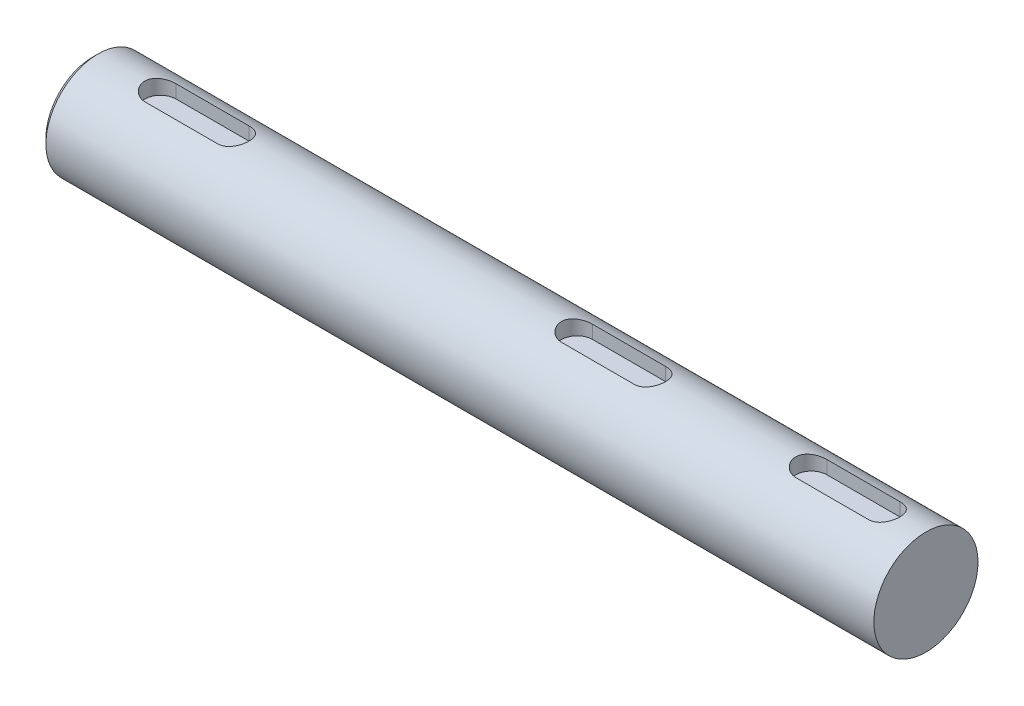
ISO-10303-21;
HEADER;
FILE_DESCRIPTION(('STEP AP214'),'2;1');
FILE_NAME('part.step','',(''),(''),'','','');
FILE_SCHEMA(('AUTOMOTIVE_DESIGN { 1 0 10303 214 1 1 1 1 }'));
ENDSEC;
DATA;
#1=APPLICATION_CONTEXT('core data for automotive mechanical design processes');
#2=APPLICATION_PROTOCOL_DEFINITION('international standard','automotive_design',2000,#1);
#3=PRODUCT_CONTEXT('',#1,'mechanical');
#4=PRODUCT('Part','Part','',(#3));
#5=PRODUCT_RELATED_PRODUCT_CATEGORY('part','',(#4));
#6=PRODUCT_DEFINITION_FORMATION('','',#4);
#7=PRODUCT_DEFINITION_CONTEXT('part definition',#1,'design');
#8=PRODUCT_DEFINITION('design','',#6,#7);
#9=PRODUCT_DEFINITION_SHAPE('','',#8);
#10=(LENGTH_UNIT() NAMED_UNIT(*) SI_UNIT(.MILLI.,.METRE.));
#11=(NAMED_UNIT(*) PLANE_ANGLE_UNIT() SI_UNIT($,.RADIAN.));
#12=(NAMED_UNIT(*) SI_UNIT($,.STERADIAN.) SOLID_ANGLE_UNIT());
#13=UNCERTAINTY_MEASURE_WITH_UNIT(LENGTH_MEASURE(1.E-05),#10,'distance_accuracy_value','');
#14=(GEOMETRIC_REPRESENTATION_CONTEXT(3) GLOBAL_UNCERTAINTY_ASSIGNED_CONTEXT((#13)) GLOBAL_UNIT_ASSIGNED_CONTEXT((#10,
#11,#12)) REPRESENTATION_CONTEXT('',''));
#15=CARTESIAN_POINT('',(0.,0.,0.));
#16=DIRECTION('',(0.,0.,1.));
#17=DIRECTION('',(1.,0.,0.));
#18=AXIS2_PLACEMENT_3D('',#15,#16,#17);
#19=CARTESIAN_POINT('',(200.,0.,0.));
#20=DIRECTION('',(-1.,0.,0.));
#21=DIRECTION('',(0.,0.,1.));
#22=AXIS2_PLACEMENT_3D('',#19,#20,#21);
#23=CYLINDRICAL_SURFACE('',#22,10.);
#24=DIRECTION('',(-1.,0.,0.));
#25=VECTOR('',#24,1.);
#26=CARTESIAN_POINT('',(200.,9.53939201416946,-3.));
#27=LINE('',#26,#25);
#28=CARTESIAN_POINT('',(138.,9.53939201416946,-3.));
#29=VERTEX_POINT('',#28);
#30=CARTESIAN_POINT('',(152.,9.53939201416946,-3.));
#31=VERTEX_POINT('',#30);
#32=EDGE_CURVE('E11',#29,#31,#27,.F.);
#33=ORIENTED_EDGE('',*,*,#32,.T.);
#34=CARTESIAN_POINT('',(152.,9.53939201416946,-3.));
#35=CARTESIAN_POINT('',(152.082335520823,9.53938054248207,-3.00001027845728));
#36=CARTESIAN_POINT('',(152.164664455063,9.54045772064378,-2.99661062684472));
#37=CARTESIAN_POINT('',(152.328693952765,9.54470412105986,-2.98307142899347));
#38=CARTESIAN_POINT('',(152.410394653324,9.54787287296849,-2.97293339805418));
#39=CARTESIAN_POINT('',(152.572384915673,9.55620668351003,-2.94603140625045));
#40=CARTESIAN_POINT('',(152.652677524043,9.56136667250114,-2.92928426957737));
#41=CARTESIAN_POINT('',(152.811475844134,9.57351626651178,-2.88932853030395));
#42=CARTESIAN_POINT('',(152.889981509067,9.58050591937828,-2.86611975872641));
#43=CARTESIAN_POINT('',(153.12194938799,9.60391637654137,-2.78708584446025));
#44=CARTESIAN_POINT('',(153.272068438833,9.6227900783039,-2.72181852542973));
#45=CARTESIAN_POINT('',(153.559226043979,9.66493213967819,-2.56815043531277));
#46=CARTESIAN_POINT('',(153.696258470762,9.6882025429064,-2.47973889924161));
#47=CARTESIAN_POINT('',(153.957722987948,9.73733650515374,-2.27929879634443));
#48=CARTESIAN_POINT('',(154.081684874061,9.76325505469874,-2.16666914746584));
#49=CARTESIAN_POINT('',(154.309273614839,9.81429628475077,-1.92227736150434));
#50=CARTESIAN_POINT('',(154.412897033861,9.8394188301941,-1.79051199848164));
#51=CARTESIAN_POINT('',(154.598926865095,9.88666477976534,-1.50821997465698));
#52=CARTESIAN_POINT('',(154.680850179783,9.90871541546877,-1.35736167401016));
#53=CARTESIAN_POINT('',(154.817977004003,9.94668940088144,-1.04324233568303));
#54=CARTESIAN_POINT('',(154.873187403368,9.96261433032403,-0.879984508687989));
#55=CARTESIAN_POINT('',(154.953759551791,9.98615279768398,-0.550649404820608));
#56=CARTESIAN_POINT('',(154.979929703518,9.99399098526792,-0.384786253016209));
#57=CARTESIAN_POINT('',(155.004234695146,10.0012640407204,-0.0508471415689363));
#58=CARTESIAN_POINT('',(155.002374842678,10.0007004995012,0.117228393125328));
#59=CARTESIAN_POINT('',(154.971214179309,9.99139205125586,0.445143199271811));
#60=CARTESIAN_POINT('',(154.942789309192,9.98290831016512,0.605074290763014));
#61=CARTESIAN_POINT('',(154.860736730375,9.95903027401823,0.9177801043703));
#62=CARTESIAN_POINT('',(154.807107701317,9.94363561692558,1.07055445110878));
#63=CARTESIAN_POINT('',(154.675575556475,9.90730429851782,1.3666956317391));
#64=CARTESIAN_POINT('',(154.597396711224,9.88630511384915,1.50993201207611));
#65=CARTESIAN_POINT('',(154.419202819966,9.84099249303647,1.78153105916099));
#66=CARTESIAN_POINT('',(154.319182881059,9.81667831471806,1.90989038323249));
#67=CARTESIAN_POINT('',(154.095616023815,9.7662334714278,2.15330901082204));
#68=CARTESIAN_POINT('',(153.971312272474,9.74006890899097,2.26766702955975));
#69=CARTESIAN_POINT('',(153.705005153149,9.68968430229327,2.47413538985067));
#70=CARTESIAN_POINT('',(153.56299663927,9.66546482675134,2.5662392402618));
#71=CARTESIAN_POINT('',(153.2634381431,9.62154457591303,2.72632814481701));
#72=CARTESIAN_POINT('',(153.105745640813,9.60189192491895,2.79406012682262));
#73=CARTESIAN_POINT('',(152.780550992037,9.56991327306402,2.90171772009404));
#74=CARTESIAN_POINT('',(152.613064278571,9.55757606951749,2.94168586436072));
#75=CARTESIAN_POINT('',(152.37001022186,9.54628064650012,2.97802407180158));
#76=CARTESIAN_POINT('',(152.296218531641,9.54370312550533,2.98626405978017));
#77=CARTESIAN_POINT('',(152.148297041801,9.54025857223564,2.99724711229708));
#78=CARTESIAN_POINT('',(152.074167900672,9.53938902493288,2.99999825936538));
#79=CARTESIAN_POINT('',(152.,9.53939201416946,3.));
#80=B_SPLINE_CURVE_WITH_KNOTS('',3,(#34,#35,#36,#37,#38,#39,#40,#41,#42,#43,#44,#45,#46,#47,#48,
#49,#50,#51,#52,#53,#54,#55,#56,#57,#58,#59,#60,#61,#62,#63,#64,#65,#66,#67,#68,#69,#70,#71,#72,
#73,#74,#75,#76,#77,#78,#79),.UNSPECIFIED.,.F.,.F.,(4,2,2,2,2,2,2,2,2,2,2,2,2,2,2,2,2,2,2,2,2,2,
4),(0.,0.246918142439474,0.49378077770608,0.740019009623012,0.986263681482012,1.47813347402023,
1.97023245590778,2.47635119822767,2.98255536239032,3.4992281062007,4.01576751791672,
4.51753600864763,5.019209488041,5.50490358251091,5.9906231236083,6.48200583350619,
6.97349873739168,7.48389234847122,7.99443465298716,8.51013494368213,9.02504345105573,
9.24774267716775,9.47011372732391),.UNSPECIFIED.);
#81=CARTESIAN_POINT('',(152.,9.53939201416946,3.));
#82=VERTEX_POINT('',#81);
#83=EDGE_CURVE('E369',#31,#82,#80,.T.);
#84=ORIENTED_EDGE('',*,*,#83,.T.);
#85=DIRECTION('',(-1.,0.,0.));
#86=VECTOR('',#85,1.);
#87=CARTESIAN_POINT('',(200.,9.53939201416946,3.));
#88=LINE('',#87,#86);
#89=CARTESIAN_POINT('',(138.,9.53939201416946,3.));
#90=VERTEX_POINT('',#89);
#91=EDGE_CURVE('E54',#82,#90,#88,.T.);
#92=ORIENTED_EDGE('',*,*,#91,.T.);
#93=CARTESIAN_POINT('',(138.,9.53939201416946,3.));
#94=CARTESIAN_POINT('',(137.917664479177,9.53938054248206,3.00001027845728));
#95=CARTESIAN_POINT('',(137.835335544937,9.54045772064378,2.99661062684472));
#96=CARTESIAN_POINT('',(137.671306047235,9.54470412105986,2.98307142899347));
#97=CARTESIAN_POINT('',(137.589605346676,9.54787287296849,2.97293339805419));
#98=CARTESIAN_POINT('',(137.427615084327,9.55620668351003,2.94603140625046));
#99=CARTESIAN_POINT('',(137.347322475957,9.56136667250114,2.92928426957737));
#100=CARTESIAN_POINT('',(137.188524155866,9.57351626651178,2.88932853030395));
#101=CARTESIAN_POINT('',(137.110018490933,9.58050591937828,2.86611975872641));
#102=CARTESIAN_POINT('',(136.87805061201,9.60391637654137,2.78708584446024));
#103=CARTESIAN_POINT('',(136.727931561167,9.62279007830391,2.72181852542972));
#104=CARTESIAN_POINT('',(136.440773956021,9.66493213967819,2.56815043531276));
#105=CARTESIAN_POINT('',(136.303741529238,9.68820254290641,2.4797388992416));
#106=CARTESIAN_POINT('',(136.042277012052,9.73733650515374,2.27929879634443));
#107=CARTESIAN_POINT('',(135.918315125939,9.76325505469874,2.16666914746584));
#108=CARTESIAN_POINT('',(135.690726385161,9.81429628475077,1.92227736150434));
#109=CARTESIAN_POINT('',(135.587102966139,9.8394188301941,1.79051199848164));
#110=CARTESIAN_POINT('',(135.401073134905,9.88666477976534,1.50821997465698));
#111=CARTESIAN_POINT('',(135.319149820217,9.90871541546877,1.35736167401016));
#112=CARTESIAN_POINT('',(135.182022995997,9.94668940088144,1.04324233568303));
#113=CARTESIAN_POINT('',(135.126812596632,9.96261433032403,0.879984508687989));
#114=CARTESIAN_POINT('',(135.046240448209,9.98615279768398,0.550649404820608));
#115=CARTESIAN_POINT('',(135.020070296482,9.99399098526792,0.384786253016209));
#116=CARTESIAN_POINT('',(134.995765304854,10.0012640407204,0.0508471415689363));
#117=CARTESIAN_POINT('',(134.997625157322,10.0007004995012,-0.117228393125328));
#118=CARTESIAN_POINT('',(135.028785820691,9.99139205125586,-0.445143199271813));
#119=CARTESIAN_POINT('',(135.057210690808,9.98290831016512,-0.605074290763019));
#120=CARTESIAN_POINT('',(135.139263269625,9.95903027401823,-0.917780104370304));
#121=CARTESIAN_POINT('',(135.192892298683,9.94363561692558,-1.07055445110878));
#122=CARTESIAN_POINT('',(135.324424443525,9.90730429851782,-1.3666956317391));
#123=CARTESIAN_POINT('',(135.402603288776,9.88630511384915,-1.5099320120761));
#124=CARTESIAN_POINT('',(135.580797180034,9.84099249303647,-1.78153105916098));
#125=CARTESIAN_POINT('',(135.680817118941,9.81667831471806,-1.90989038323249));
#126=CARTESIAN_POINT('',(135.904383976185,9.7662334714278,-2.15330901082205));
#127=CARTESIAN_POINT('',(136.028687727526,9.74006890899097,-2.26766702955975));
#128=CARTESIAN_POINT('',(136.294994846851,9.68968430229327,-2.47413538985067));
#129=CARTESIAN_POINT('',(136.43700336073,9.66546482675134,-2.5662392402618));
#130=CARTESIAN_POINT('',(136.7365618569,9.62154457591303,-2.72632814481701));
#131=CARTESIAN_POINT('',(136.894254359187,9.60189192491895,-2.79406012682262));
#132=CARTESIAN_POINT('',(137.219449007963,9.56991327306402,-2.90171772009404));
#133=CARTESIAN_POINT('',(137.386935721429,9.55757606951749,-2.94168586436072));
#134=CARTESIAN_POINT('',(137.62998977814,9.54628064650012,-2.97802407180158));
#135=CARTESIAN_POINT('',(137.703781468359,9.54370312550533,-2.98626405978017));
#136=CARTESIAN_POINT('',(137.851702958199,9.54025857223564,-2.99724711229708));
#137=CARTESIAN_POINT('',(137.925832099328,9.53938902493288,-2.99999825936538));
#138=CARTESIAN_POINT('',(138.,9.53939201416946,-3.));
#139=B_SPLINE_CURVE_WITH_KNOTS('',3,(#93,#94,#95,#96,#97,#98,#99,#100,#101,#102,#103,#104,#105,
#106,#107,#108,#109,#110,#111,#112,#113,#114,#115,#116,#117,#118,#119,#120,#121,#122,#123,#124,
#125,#126,#127,#128,#129,#130,#131,#132,#133,#134,#135,#136,#137,#138),.UNSPECIFIED.,.F.,.F.,(4,
2,2,2,2,2,2,2,2,2,2,2,2,2,2,2,2,2,2,2,2,2,4),(0.,0.246918142439474,0.493780777706052,
0.740019009623012,0.986263681482012,1.47813347402026,1.97023245590778,2.47635119822767,
2.98255536239032,3.4992281062007,4.01576751791672,4.51753600864763,5.019209488041,
5.50490358251092,5.9906231236083,6.48200583350618,6.97349873739168,7.48389234847122,
7.99443465298716,8.51013494368213,9.02504345105573,9.24774267716778,9.47011372732391),.UNSPECIFIED.);
#140=EDGE_CURVE('E61',#90,#29,#139,.T.);
#141=ORIENTED_EDGE('',*,*,#140,.T.);
#142=EDGE_LOOP('',(#33,#84,#92,#141));
#143=FACE_BOUND('',#142,.T.);
#144=DIRECTION('',(-1.,0.,0.));
#145=VECTOR('',#144,1.);
#146=CARTESIAN_POINT('',(200.,9.53939201416946,-3.));
#147=LINE('',#146,#145);
#148=CARTESIAN_POINT('',(13.,9.53939201416946,-3.));
#149=VERTEX_POINT('',#148);
#150=CARTESIAN_POINT('',(27.,9.53939201416946,-3.));
#151=VERTEX_POINT('',#150);
#152=EDGE_CURVE('E295',#149,#151,#147,.F.);
#153=ORIENTED_EDGE('',*,*,#152,.T.);
#154=CARTESIAN_POINT('',(27.,9.53939201416946,-3.));
#155=CARTESIAN_POINT('',(27.0823355208227,9.53938054248207,-3.00001027845728));
#156=CARTESIAN_POINT('',(27.1646644550632,9.54045772064378,-2.99661062684472));
#157=CARTESIAN_POINT('',(27.3286939527655,9.54470412105986,-2.98307142899347));
#158=CARTESIAN_POINT('',(27.4103946533244,9.54787287296848,-2.97293339805418));
#159=CARTESIAN_POINT('',(27.5723849156732,9.55620668351003,-2.94603140625045));
#160=CARTESIAN_POINT('',(27.652677524043,9.56136667250114,-2.92928426957737));
#161=CARTESIAN_POINT('',(27.8114758441342,9.57351626651178,-2.88932853030395));
#162=CARTESIAN_POINT('',(27.8899815090674,9.58050591937828,-2.86611975872641));
#163=CARTESIAN_POINT('',(28.1219493879901,9.60391637654137,-2.78708584446024));
#164=CARTESIAN_POINT('',(28.272068438833,9.62279007830391,-2.72181852542972));
#165=CARTESIAN_POINT('',(28.559226043979,9.66493213967819,-2.56815043531276));
#166=CARTESIAN_POINT('',(28.6962584707622,9.6882025429064,-2.4797388992416));
#167=CARTESIAN_POINT('',(28.9577229879478,9.73733650515374,-2.27929879634443));
#168=CARTESIAN_POINT('',(29.0816848740609,9.76325505469874,-2.16666914746584));
#169=CARTESIAN_POINT('',(29.3092736148388,9.81429628475077,-1.92227736150433));
#170=CARTESIAN_POINT('',(29.412897033861,9.8394188301941,-1.79051199848164));
#171=CARTESIAN_POINT('',(29.5989268650946,9.88666477976534,-1.50821997465697));
#172=CARTESIAN_POINT('',(29.6808501797826,9.90871541546877,-1.35736167401016));
#173=CARTESIAN_POINT('',(29.8179770040029,9.94668940088144,-1.04324233568303));
#174=CARTESIAN_POINT('',(29.873187403368,9.96261433032403,-0.879984508687986));
#175=CARTESIAN_POINT('',(29.953759551791,9.98615279768398,-0.550649404820603));
#176=CARTESIAN_POINT('',(29.9799297035176,9.99399098526792,-0.384786253016205));
#177=CARTESIAN_POINT('',(30.004234695146,10.0012640407204,-0.0508471415689293));
#178=CARTESIAN_POINT('',(30.0023748426782,10.0007004995012,0.117228393125337));
#179=CARTESIAN_POINT('',(29.9712141793086,9.99139205125586,0.445143199271823));
#180=CARTESIAN_POINT('',(29.9427893091919,9.98290831016512,0.605074290763026));
#181=CARTESIAN_POINT('',(29.8607367303745,9.95903027401822,0.917780104370312));
#182=CARTESIAN_POINT('',(29.8071077013173,9.94363561692558,1.07055445110879));
#183=CARTESIAN_POINT('',(29.6755755564753,9.90730429851782,1.36669563173911));
#184=CARTESIAN_POINT('',(29.5973967112239,9.88630511384915,1.50993201207612));
#185=CARTESIAN_POINT('',(29.4192028199656,9.84099249303647,1.781531059161));
#186=CARTESIAN_POINT('',(29.3191828810593,9.81667831471806,1.9098903832325));
#187=CARTESIAN_POINT('',(29.0956160238154,9.7662334714278,2.15330901082205));
#188=CARTESIAN_POINT('',(28.9713122724738,9.74006890899097,2.26766702955975));
#189=CARTESIAN_POINT('',(28.7050051531489,9.68968430229327,2.47413538985067));
#190=CARTESIAN_POINT('',(28.5629966392702,9.66546482675134,2.5662392402618));
#191=CARTESIAN_POINT('',(28.2634381431001,9.62154457591303,2.72632814481701));
#192=CARTESIAN_POINT('',(28.1057456408129,9.60189192491895,2.79406012682262));
#193=CARTESIAN_POINT('',(27.7805509920369,9.56991327306402,2.90171772009404));
#194=CARTESIAN_POINT('',(27.6130642785713,9.55757606951749,2.94168586436072));
#195=CARTESIAN_POINT('',(27.3700102218596,9.54628064650012,2.97802407180159));
#196=CARTESIAN_POINT('',(27.2962185316408,9.54370312550533,2.98626405978017));
#197=CARTESIAN_POINT('',(27.148297041801,9.54025857223564,2.99724711229708));
#198=CARTESIAN_POINT('',(27.0741679006723,9.53938902493288,2.99999825936538));
#199=CARTESIAN_POINT('',(27.,9.53939201416946,3.));
#200=B_SPLINE_CURVE_WITH_KNOTS('',3,(#154,#155,#156,#157,#158,#159,#160,#161,#162,#163,#164,
#165,#166,#167,#168,#169,#170,#171,#172,#173,#174,#175,#176,#177,#178,#179,#180,#181,#182,#183,
#184,#185,#186,#187,#188,#189,#190,#191,#192,#193,#194,#195,#196,#197,#198,#199),.UNSPECIFIED.,
.F.,.F.,(4,2,2,2,2,2,2,2,2,2,2,2,2,2,2,2,2,2,2,2,2,2,4),(0.,0.246918142439467,0.493780777706087,
0.740019009623012,0.986263681482023,1.47813347402025,1.97023245590779,2.47635119822766,
2.98255536239033,3.4992281062007,4.01576751791672,4.51753600864764,5.019209488041,
5.50490358251092,5.99062312360831,6.48200583350621,6.97349873739169,7.48389234847121,
7.99443465298714,8.51013494368214,9.02504345105574,9.24774267716777,9.47011372732391),.UNSPECIFIED.);
#201=CARTESIAN_POINT('',(27.,9.53939201416946,3.));
#202=VERTEX_POINT('',#201);
#203=EDGE_CURVE('E230',#151,#202,#200,.T.);
#204=ORIENTED_EDGE('',*,*,#203,.T.);
#205=DIRECTION('',(-1.,0.,0.));
#206=VECTOR('',#205,1.);
#207=CARTESIAN_POINT('',(200.,9.53939201416946,3.));
#208=LINE('',#207,#206);
#209=CARTESIAN_POINT('',(13.,9.53939201416946,3.));
#210=VERTEX_POINT('',#209);
#211=EDGE_CURVE('E334',#202,#210,#208,.T.);
#212=ORIENTED_EDGE('',*,*,#211,.T.);
#213=CARTESIAN_POINT('',(13.,9.53939201416946,3.));
#214=CARTESIAN_POINT('',(12.9176644791773,9.53938054248207,3.00001027845728));
#215=CARTESIAN_POINT('',(12.8353355449368,9.54045772064378,2.99661062684472));
#216=CARTESIAN_POINT('',(12.6713060472345,9.54470412105986,2.98307142899347));
#217=CARTESIAN_POINT('',(12.5896053466756,9.54787287296848,2.97293339805418));
#218=CARTESIAN_POINT('',(12.4276150843268,9.55620668351003,2.94603140625045));
#219=CARTESIAN_POINT('',(12.347322475957,9.56136667250114,2.92928426957737));
#220=CARTESIAN_POINT('',(12.1885241558658,9.57351626651178,2.88932853030395));
#221=CARTESIAN_POINT('',(12.1100184909326,9.58050591937828,2.86611975872641));
#222=CARTESIAN_POINT('',(11.8780506120099,9.60391637654137,2.78708584446024));
#223=CARTESIAN_POINT('',(11.727931561167,9.62279007830391,2.72181852542972));
#224=CARTESIAN_POINT('',(11.440773956021,9.66493213967819,2.56815043531276));
#225=CARTESIAN_POINT('',(11.3037415292378,9.6882025429064,2.4797388992416));
#226=CARTESIAN_POINT('',(11.0422770120522,9.73733650515374,2.27929879634442));
#227=CARTESIAN_POINT('',(10.9183151259391,9.76325505469874,2.16666914746584));
#228=CARTESIAN_POINT('',(10.6907263851612,9.81429628475077,1.92227736150433));
#229=CARTESIAN_POINT('',(10.587102966139,9.8394188301941,1.79051199848164));
#230=CARTESIAN_POINT('',(10.4010731349054,9.88666477976534,1.50821997465697));
#231=CARTESIAN_POINT('',(10.3191498202174,9.90871541546877,1.35736167401016));
#232=CARTESIAN_POINT('',(10.1820229959971,9.94668940088144,1.04324233568303));
#233=CARTESIAN_POINT('',(10.126812596632,9.96261433032403,0.879984508687984));
#234=CARTESIAN_POINT('',(10.046240448209,9.98615279768398,0.550649404820601));
#235=CARTESIAN_POINT('',(10.0200702964824,9.99399098526792,0.384786253016202));
#236=CARTESIAN_POINT('',(9.99576530485396,10.0012640407204,0.0508471415689264));
#237=CARTESIAN_POINT('',(9.99762515732182,10.0007004995012,-0.117228393125341));
#238=CARTESIAN_POINT('',(10.0287858206914,9.99139205125586,-0.445143199271826));
#239=CARTESIAN_POINT('',(10.0572106908081,9.98290831016512,-0.605074290763029));
#240=CARTESIAN_POINT('',(10.1392632696255,9.95903027401822,-0.917780104370315));
#241=CARTESIAN_POINT('',(10.1928922986827,9.94363561692558,-1.07055445110879));
#242=CARTESIAN_POINT('',(10.3244244435248,9.90730429851782,-1.36669563173912));
#243=CARTESIAN_POINT('',(10.4026032887761,9.88630511384915,-1.50993201207613));
#244=CARTESIAN_POINT('',(10.5807971800344,9.84099249303646,-1.781531059161));
#245=CARTESIAN_POINT('',(10.6808171189407,9.81667831471806,-1.90989038323251));
#246=CARTESIAN_POINT('',(10.9043839761846,9.7662334714278,-2.15330901082206));
#247=CARTESIAN_POINT('',(11.0286877275262,9.74006890899097,-2.26766702955975));
#248=CARTESIAN_POINT('',(11.2949948468511,9.68968430229327,-2.47413538985067));
#249=CARTESIAN_POINT('',(11.4370033607298,9.66546482675134,-2.5662392402618));
#250=CARTESIAN_POINT('',(11.7365618568999,9.62154457591303,-2.72632814481701));
#251=CARTESIAN_POINT('',(11.8942543591871,9.60189192491895,-2.79406012682263));
#252=CARTESIAN_POINT('',(12.2194490079631,9.56991327306402,-2.90171772009404));
#253=CARTESIAN_POINT('',(12.3869357214287,9.55757606951749,-2.94168586436072));
#254=CARTESIAN_POINT('',(12.6299897781404,9.54628064650011,-2.97802407180159));
#255=CARTESIAN_POINT('',(12.7037814683592,9.54370312550533,-2.98626405978017));
#256=CARTESIAN_POINT('',(12.851702958199,9.54025857223564,-2.99724711229708));
#257=CARTESIAN_POINT('',(12.9258320993277,9.53938902493288,-2.99999825936538));
#258=CARTESIAN_POINT('',(13.,9.53939201416946,-3.));
#259=B_SPLINE_CURVE_WITH_KNOTS('',3,(#213,#214,#215,#216,#217,#218,#219,#220,#221,#222,#223,
#224,#225,#226,#227,#228,#229,#230,#231,#232,#233,#234,#235,#236,#237,#238,#239,#240,#241,#242,
#243,#244,#245,#246,#247,#248,#249,#250,#251,#252,#253,#254,#255,#256,#257,#258),.UNSPECIFIED.,
.F.,.F.,(4,2,2,2,2,2,2,2,2,2,2,2,2,2,2,2,2,2,2,2,2,2,4),(0.,0.246918142439467,0.493780777706085,
0.740019009623011,0.986263681482025,1.47813347402025,1.97023245590779,2.47635119822767,
2.98255536239033,3.49922810620071,4.01576751791672,4.51753600864764,5.01920948804101,
5.50490358251093,5.99062312360832,6.48200583350621,6.9734987373917,7.48389234847122,
7.99443465298715,8.51013494368214,9.02504345105574,9.24774267716778,9.47011372732391),.UNSPECIFIED.);
#260=EDGE_CURVE('E250',#210,#149,#259,.T.);
#261=ORIENTED_EDGE('',*,*,#260,.T.);
#262=EDGE_LOOP('',(#153,#204,#212,#261));
#263=FACE_BOUND('',#262,.T.);
#264=CARTESIAN_POINT('',(0.999999999999973,0.,0.));
#265=DIRECTION('',(1.,0.,0.));
#266=DIRECTION('',(0.,0.,-1.));
#267=AXIS2_PLACEMENT_3D('',#264,#265,#266);
#268=CIRCLE('',#267,10.);
#269=CARTESIAN_POINT('',(0.999999999999973,0.,-10.));
#270=VERTEX_POINT('',#269);
#271=EDGE_CURVE('E288',#270,#270,#268,.T.);
#272=ORIENTED_EDGE('',*,*,#271,.T.);
#273=EDGE_LOOP('',(#272));
#274=FACE_BOUND('',#273,.T.);
#275=DIRECTION('',(-1.,0.,0.));
#276=VECTOR('',#275,1.);
#277=CARTESIAN_POINT('',(200.,9.53939201416946,-3.));
#278=LINE('',#277,#276);
#279=CARTESIAN_POINT('',(93.,9.53939201416946,-3.));
#280=VERTEX_POINT('',#279);
#281=CARTESIAN_POINT('',(107.,9.53939201416946,-3.));
#282=VERTEX_POINT('',#281);
#283=EDGE_CURVE('E346',#280,#282,#278,.F.);
#284=ORIENTED_EDGE('',*,*,#283,.T.);
#285=CARTESIAN_POINT('',(107.,9.53939201416946,3.));
#286=CARTESIAN_POINT('',(106.835610904115,9.5393937145396,2.99999795267528));
#287=CARTESIAN_POINT('',(106.671201551712,9.54368780418137,2.98644216334284));
#288=CARTESIAN_POINT('',(106.347189500816,9.56033156605799,2.93271688893498));
#289=CARTESIAN_POINT('',(106.187588426997,9.57268392986936,2.89253851147156));
#290=CARTESIAN_POINT('',(105.877930543457,9.60392204971265,2.7870550653991));
#291=CARTESIAN_POINT('',(105.727858340734,9.62279693406465,2.72179178788487));
#292=CARTESIAN_POINT('',(105.440756132009,9.66493865095134,2.56812843835858));
#293=CARTESIAN_POINT('',(105.303728082631,9.68820614082039,2.47972490274106));
#294=CARTESIAN_POINT('',(105.042267218845,9.73733724371531,2.27929508283254));
#295=CARTESIAN_POINT('',(104.918308204107,9.76325616623271,2.16666414351613));
#296=CARTESIAN_POINT('',(104.690724097355,9.81429723873514,1.92227247515919));
#297=CARTESIAN_POINT('',(104.5871016191,9.8394192859541,1.79050929092222));
#298=CARTESIAN_POINT('',(104.401074600333,9.88666429158777,1.50822287558738));
#299=CARTESIAN_POINT('',(104.319153151114,9.90871448684808,1.35736804267163));
#300=CARTESIAN_POINT('',(104.182025481914,9.94668871841369,1.0432492907387));
#301=CARTESIAN_POINT('',(104.126813500285,9.96261407578992,0.879988056775821));
#302=CARTESIAN_POINT('',(104.046239997819,9.98615292007178,0.550647705261657));
#303=CARTESIAN_POINT('',(104.020069744695,9.99399114738673,0.3847827979076));
#304=CARTESIAN_POINT('',(103.995765350707,10.001264030027,0.0508436474986244));
#305=CARTESIAN_POINT('',(103.997625321196,10.0007004504217,-0.117230124100747));
#306=CARTESIAN_POINT('',(104.028785737086,9.99139207635305,-0.445142313200319));
#307=CARTESIAN_POINT('',(104.05721038762,9.98290840410475,-0.605072535282667));
#308=CARTESIAN_POINT('',(104.139262671989,9.95903044225231,-0.917778426885081));
#309=CARTESIAN_POINT('',(104.192891901885,9.9436357150134,-1.07055364264578));
#310=CARTESIAN_POINT('',(104.324424046837,9.90730441973756,-1.36669465270248));
#311=CARTESIAN_POINT('',(104.402602405614,9.88630539352772,-1.50993012938864));
#312=CARTESIAN_POINT('',(104.580795704857,9.84099281296778,-1.78152934756663));
#313=CARTESIAN_POINT('',(104.680815825929,9.81667847277943,-1.90988954974545));
#314=CARTESIAN_POINT('',(104.904395501501,9.76623100973852,-2.15332096305837));
#315=CARTESIAN_POINT('',(105.028713838051,9.74006390633503,-2.26768916079756));
#316=CARTESIAN_POINT('',(105.295020035789,9.68967959784414,-2.47415303080115));
#317=CARTESIAN_POINT('',(105.437009650811,9.66546258669242,-2.56624648967452));
#318=CARTESIAN_POINT('',(105.736478938472,9.62155806359712,-2.72627990669511));
#319=CARTESIAN_POINT('',(105.894094091617,9.60191621258491,-2.79397978469377));
#320=CARTESIAN_POINT('',(106.219214416779,9.5699278496379,-2.90166725750739));
#321=CARTESIAN_POINT('',(106.386716343035,9.55757895796639,-2.94166389279494));
#322=CARTESIAN_POINT('',(106.720164721502,9.54209699116239,-2.99149540565762));
#323=CARTESIAN_POINT('',(106.885936447794,9.53863757349917,-3.00239892760807));
#324=CARTESIAN_POINT('',(107.216945800013,9.54042384874812,-2.99671894465741));
#325=CARTESIAN_POINT('',(107.38218349746,9.54566832310787,-2.98013928742559));
#326=CARTESIAN_POINT('',(107.702976755943,9.56395117112153,-2.92091527148479));
#327=CARTESIAN_POINT('',(107.858672328527,9.57678353015602,-2.87895922862587));
#328=CARTESIAN_POINT('',(108.160803381629,9.6085828246183,-2.77097155495854));
#329=CARTESIAN_POINT('',(108.307237428281,9.62755070717977,-2.70493620685512));
#330=CARTESIAN_POINT('',(108.591034928144,9.67011670046268,-2.54863742393008));
#331=CARTESIAN_POINT('',(108.728049441972,9.69382542139644,-2.4577712834546));
#332=CARTESIAN_POINT('',(108.985276212362,9.74296411293928,-2.25510603200767));
#333=CARTESIAN_POINT('',(109.105484435226,9.76839449459994,-2.14330191069793));
#334=CARTESIAN_POINT('',(109.330360811629,9.81927267096329,-1.89691026498721));
#335=CARTESIAN_POINT('',(109.434271257974,9.84468490126011,-1.76162213171487));
#336=CARTESIAN_POINT('',(109.617933402055,9.89169703497298,-1.4749235691805));
#337=CARTESIAN_POINT('',(109.697686299563,9.91329712769433,-1.32351394108789));
#338=CARTESIAN_POINT('',(109.830000061137,9.95011940949915,-1.00987100941044));
#339=CARTESIAN_POINT('',(109.882764032318,9.96538906849932,-0.847729244075675));
#340=CARTESIAN_POINT('',(109.960121837781,9.98803959193653,-0.516339933009173));
#341=CARTESIAN_POINT('',(109.984723731897,9.9954227134176,-0.347094434709524));
#342=CARTESIAN_POINT('',(110.004446088109,10.001330881628,-0.0133043077654857));
#343=CARTESIAN_POINT('',(110.000665390816,10.0001861022264,0.151170358172413));
#344=CARTESIAN_POINT('',(109.966356735002,9.98994528930073,0.477038962328808));
#345=CARTESIAN_POINT('',(109.935830293039,9.98084970660925,0.638433074693057));
#346=CARTESIAN_POINT('',(109.849576677201,9.95582336716653,0.951871626082715));
#347=CARTESIAN_POINT('',(109.794123638702,9.93996705801731,1.10399785470278));
#348=CARTESIAN_POINT('',(109.659836170986,9.903058860789,1.3968664755041));
#349=CARTESIAN_POINT('',(109.580997899428,9.88200611899892,1.53760699210116));
#350=CARTESIAN_POINT('',(109.39925308514,9.83607931656457,1.80860378484113));
#351=CARTESIAN_POINT('',(109.295657139998,9.81110453847119,1.93838050015353));
#352=CARTESIAN_POINT('',(109.068579223334,9.76047074424668,2.17907514269189));
#353=CARTESIAN_POINT('',(108.945091524204,9.73481153282158,2.28998761920387));
#354=CARTESIAN_POINT('',(108.677318443379,9.68481361262638,2.49312538789097));
#355=CARTESIAN_POINT('',(108.532522893219,9.6605370538697,2.58469519515913));
#356=CARTESIAN_POINT('',(108.228889651678,9.61705095017586,2.74208627057551));
#357=CARTESIAN_POINT('',(108.070058752798,9.59783897193911,2.80791991114577));
#358=CARTESIAN_POINT('',(107.760519136787,9.56855633435189,2.90603885065899));
#359=CARTESIAN_POINT('',(107.610782706138,9.5577230968104,2.94117718022463));
#360=CARTESIAN_POINT('',(107.307369555008,9.54314085194333,2.98815637670288));
#361=CARTESIAN_POINT('',(107.15369363071,9.53939042442861,3.00000191412191));
#362=CARTESIAN_POINT('',(107.,9.53939201416946,3.));
#363=B_SPLINE_CURVE_WITH_KNOTS('',3,(#285,#286,#287,#288,#289,#290,#291,#292,#293,#294,#295,
#296,#297,#298,#299,#300,#301,#302,#303,#304,#305,#306,#307,#308,#309,#310,#311,#312,#313,#314,
#315,#316,#317,#318,#319,#320,#321,#322,#323,#324,#325,#326,#327,#328,#329,#330,#331,#332,#333,
#334,#335,#336,#337,#338,#339,#340,#341,#342,#343,#344,#345,#346,#347,#348,#349,#350,#351,#352,
#353,#354,#355,#356,#357,#358,#359,#360,#361,#362),.UNSPECIFIED.,.T.,.F.,(4,2,2,2,2,2,2,2,2,2,2,
2,2,2,2,2,2,2,2,2,2,2,2,2,2,2,2,2,2,2,2,2,2,2,2,2,2,2,4),(0.,0.492600331831084,
0.985365283378001,1.4773128289324,1.9693340507402,2.47546300015968,2.98165695742546,
3.4983187854729,4.01486911175754,4.51664280299116,5.01831108202881,5.50400251981761,
5.98972471780753,6.48110418671352,6.97260033181661,7.48304294046556,7.99353624983726,
8.50892476494934,9.02414501262032,9.52016161585828,10.0161087821998,10.4991718988284,
10.9823096209678,11.4784146362399,11.9746385186306,12.4895901220641,13.0045161465361,
13.5155078363386,14.0263532464857,14.5175260782765,15.0086710610072,15.4945419374965,
15.9804926898797,16.4819925411419,16.9836370526499,17.500232793435,18.016579879331,
18.477223077201,18.9377739007233),.UNSPECIFIED.);
#364=CARTESIAN_POINT('',(107.,9.53939201416946,3.));
#365=VERTEX_POINT('',#364);
#366=EDGE_CURVE('E287',#282,#365,#363,.T.);
#367=ORIENTED_EDGE('',*,*,#366,.T.);
#368=DIRECTION('',(-1.,0.,0.));
#369=VECTOR('',#368,1.);
#370=CARTESIAN_POINT('',(200.,9.53939201416946,3.));
#371=LINE('',#370,#369);
#372=CARTESIAN_POINT('',(93.,9.53939201416946,3.));
#373=VERTEX_POINT('',#372);
#374=EDGE_CURVE('E525',#365,#373,#371,.T.);
#375=ORIENTED_EDGE('',*,*,#374,.T.);
#376=CARTESIAN_POINT('',(93.,9.53939201416946,3.));
#377=CARTESIAN_POINT('',(92.8356109041152,9.5393937145396,2.99999795267528));
#378=CARTESIAN_POINT('',(92.6712015517119,9.54368780418137,2.98644216334284));
#379=CARTESIAN_POINT('',(92.3471895008161,9.56033156605799,2.93271688893498));
#380=CARTESIAN_POINT('',(92.1875884269971,9.57268392986936,2.89253851147156));
#381=CARTESIAN_POINT('',(91.8779305434565,9.60392204971265,2.78705506539911));
#382=CARTESIAN_POINT('',(91.7278583407338,9.62279693406464,2.72179178788487));
#383=CARTESIAN_POINT('',(91.4407561320094,9.66493865095134,2.56812843835858));
#384=CARTESIAN_POINT('',(91.3037280826311,9.68820614082039,2.47972490274106));
#385=CARTESIAN_POINT('',(91.0422672188453,9.73733724371531,2.27929508283254));
#386=CARTESIAN_POINT('',(90.9183082041074,9.76325616623271,2.16666414351614));
#387=CARTESIAN_POINT('',(90.690724097355,9.81429723873514,1.9222724751592));
#388=CARTESIAN_POINT('',(90.5871016191003,9.8394192859541,1.79050929092223));
#389=CARTESIAN_POINT('',(90.4010746003334,9.88666429158778,1.50822287558738));
#390=CARTESIAN_POINT('',(90.3191531511144,9.90871448684808,1.35736804267163));
#391=CARTESIAN_POINT('',(90.1820254819145,9.94668871841369,1.0432492907387));
#392=CARTESIAN_POINT('',(90.1268135002851,9.96261407578992,0.879988056775817));
#393=CARTESIAN_POINT('',(90.046239997819,9.98615292007178,0.550647705261654));
#394=CARTESIAN_POINT('',(90.0200697446946,9.99399114738673,0.384782797907598));
#395=CARTESIAN_POINT('',(89.9957653507071,10.001264030027,0.050843647498625));
#396=CARTESIAN_POINT('',(89.9976253211961,10.0007004504217,-0.117230124100745));
#397=CARTESIAN_POINT('',(90.028785737086,9.99139207635305,-0.445142313200317));
#398=CARTESIAN_POINT('',(90.0572103876197,9.98290840410475,-0.605072535282664));
#399=CARTESIAN_POINT('',(90.1392626719886,9.95903044225231,-0.917778426885079));
#400=CARTESIAN_POINT('',(90.1928919018855,9.9436357150134,-1.07055364264578));
#401=CARTESIAN_POINT('',(90.324424046837,9.90730441973756,-1.36669465270248));
#402=CARTESIAN_POINT('',(90.4026024056139,9.88630539352772,-1.50993012938864));
#403=CARTESIAN_POINT('',(90.580795704857,9.84099281296778,-1.78152934756663));
#404=CARTESIAN_POINT('',(90.6808158259292,9.81667847277943,-1.90988954974545));
#405=CARTESIAN_POINT('',(90.9043955015009,9.76623100973852,-2.15332096305837));
#406=CARTESIAN_POINT('',(91.0287138380508,9.74006390633503,-2.26768916079756));
#407=CARTESIAN_POINT('',(91.2950200357888,9.68967959784414,-2.47415303080115));
#408=CARTESIAN_POINT('',(91.437009650811,9.66546258669242,-2.56624648967452));
#409=CARTESIAN_POINT('',(91.7364789384722,9.62155806359712,-2.72627990669511));
#410=CARTESIAN_POINT('',(91.8940940916175,9.60191621258491,-2.79397978469377));
#411=CARTESIAN_POINT('',(92.2192144167786,9.5699278496379,-2.90166725750739));
#412=CARTESIAN_POINT('',(92.386716343035,9.55757895796639,-2.94166389279494));
#413=CARTESIAN_POINT('',(92.7201647215024,9.54209699116239,-2.99149540565762));
#414=CARTESIAN_POINT('',(92.8859364477944,9.53863757349917,-3.00239892760807));
#415=CARTESIAN_POINT('',(93.2169458000133,9.54042384874812,-2.99671894465741));
#416=CARTESIAN_POINT('',(93.38218349746,9.54566832310787,-2.98013928742559));
#417=CARTESIAN_POINT('',(93.7029767559434,9.56395117112153,-2.92091527148479));
#418=CARTESIAN_POINT('',(93.8586723285275,9.57678353015602,-2.87895922862587));
#419=CARTESIAN_POINT('',(94.1608033816294,9.6085828246183,-2.77097155495853));
#420=CARTESIAN_POINT('',(94.307237428281,9.62755070717977,-2.70493620685512));
#421=CARTESIAN_POINT('',(94.5910349281444,9.67011670046268,-2.54863742393008));
#422=CARTESIAN_POINT('',(94.7280494419716,9.69382542139644,-2.4577712834546));
#423=CARTESIAN_POINT('',(94.9852762123616,9.74296411293928,-2.25510603200768));
#424=CARTESIAN_POINT('',(95.1054844352256,9.76839449459994,-2.14330191069793));
#425=CARTESIAN_POINT('',(95.3303608116295,9.81927267096329,-1.89691026498721));
#426=CARTESIAN_POINT('',(95.434271257974,9.84468490126011,-1.76162213171487));
#427=CARTESIAN_POINT('',(95.6179334020555,9.89169703497298,-1.4749235691805));
#428=CARTESIAN_POINT('',(95.6976862995629,9.91329712769433,-1.32351394108789));
#429=CARTESIAN_POINT('',(95.8300000611366,9.95011940949915,-1.00987100941044));
#430=CARTESIAN_POINT('',(95.882764032318,9.96538906849931,-0.847729244075677));
#431=CARTESIAN_POINT('',(95.9601218377808,9.98803959193653,-0.516339933009175));
#432=CARTESIAN_POINT('',(95.9847237318968,9.9954227134176,-0.347094434709525));
#433=CARTESIAN_POINT('',(96.004446088109,10.001330881628,-0.0133043077654857));
#434=CARTESIAN_POINT('',(96.0006653908157,10.0001861022264,0.151170358172413));
#435=CARTESIAN_POINT('',(95.9663567350018,9.98994528930073,0.477038962328808));
#436=CARTESIAN_POINT('',(95.9358302930391,9.98084970660925,0.638433074693057));
#437=CARTESIAN_POINT('',(95.8495766772007,9.95582336716653,0.951871626082717));
#438=CARTESIAN_POINT('',(95.794123638702,9.93996705801731,1.10399785470279));
#439=CARTESIAN_POINT('',(95.6598361709856,9.903058860789,1.39686647550411));
#440=CARTESIAN_POINT('',(95.5809978994276,9.88200611899892,1.53760699210116));
#441=CARTESIAN_POINT('',(95.3992530851399,9.83607931656456,1.80860378484113));
#442=CARTESIAN_POINT('',(95.2956571399985,9.81110453847118,1.93838050015354));
#443=CARTESIAN_POINT('',(95.0685792233344,9.76047074424667,2.1790751426919));
#444=CARTESIAN_POINT('',(94.9450915242037,9.73481153282158,2.28998761920387));
#445=CARTESIAN_POINT('',(94.677318443379,9.68481361262638,2.49312538789097));
#446=CARTESIAN_POINT('',(94.5325228932191,9.66053705386971,2.58469519515913));
#447=CARTESIAN_POINT('',(94.228889651678,9.61705095017586,2.74208627057551));
#448=CARTESIAN_POINT('',(94.0700587527976,9.59783897193911,2.80791991114577));
#449=CARTESIAN_POINT('',(93.7605191367875,9.56855633435189,2.90603885065899));
#450=CARTESIAN_POINT('',(93.610782706138,9.5577230968104,2.94117718022463));
#451=CARTESIAN_POINT('',(93.3073695550085,9.54314085194333,2.98815637670288));
#452=CARTESIAN_POINT('',(93.1536936307095,9.53939042442861,3.00000191412191));
#453=CARTESIAN_POINT('',(93.,9.53939201416946,3.));
#454=B_SPLINE_CURVE_WITH_KNOTS('',3,(#376,#377,#378,#379,#380,#381,#382,#383,#384,#385,#386,
#387,#388,#389,#390,#391,#392,#393,#394,#395,#396,#397,#398,#399,#400,#401,#402,#403,#404,#405,
#406,#407,#408,#409,#410,#411,#412,#413,#414,#415,#416,#417,#418,#419,#420,#421,#422,#423,#424,
#425,#426,#427,#428,#429,#430,#431,#432,#433,#434,#435,#436,#437,#438,#439,#440,#441,#442,#443,
#444,#445,#446,#447,#448,#449,#450,#451,#452,#453),.UNSPECIFIED.,.T.,.F.,(4,2,2,2,2,2,2,2,2,2,2,
2,2,2,2,2,2,2,2,2,2,2,2,2,2,2,2,2,2,2,2,2,2,2,2,2,2,2,4),(0.,0.492600331831084,
0.985365283378001,1.47731282893238,1.9693340507402,2.47546300015967,2.98165695742546,
3.4983187854729,4.01486911175755,4.51664280299116,5.01831108202881,5.50400251981761,
5.98972471780753,6.48110418671352,6.97260033181661,7.48304294046556,7.99353624983726,
8.50892476494934,9.02414501262032,9.52016161585828,10.0161087821998,10.4991718988284,
10.9823096209678,11.4784146362399,11.9746385186306,12.4895901220641,13.0045161465361,
13.5155078363386,14.0263532464857,14.5175260782765,15.0086710610072,15.4945419374965,
15.9804926898797,16.4819925411419,16.9836370526499,17.500232793435,18.016579879331,
18.477223077201,18.9377739007233),.UNSPECIFIED.);
#455=EDGE_CURVE('E69',#373,#280,#454,.T.);
#456=ORIENTED_EDGE('',*,*,#455,.T.);
#457=EDGE_LOOP('',(#284,#367,#375,#456));
#458=FACE_BOUND('',#457,.T.);
#459=CARTESIAN_POINT('',(160.,0.,0.));
#460=DIRECTION('',(1.,0.,0.));
#461=DIRECTION('',(0.,0.,-1.));
#462=AXIS2_PLACEMENT_3D('',#459,#460,#461);
#463=CIRCLE('',#462,10.);
#464=CARTESIAN_POINT('',(160.,0.,-10.));
#465=VERTEX_POINT('',#464);
#466=EDGE_CURVE('E169',#465,#465,#463,.T.);
#467=ORIENTED_EDGE('',*,*,#466,.F.);
#468=EDGE_LOOP('',(#467));
#469=FACE_BOUND('',#468,.T.);
#470=ADVANCED_FACE('F44',(#143,#263,#274,#458,#469),#23,.T.);
#471=CARTESIAN_POINT('',(0.,0.,0.));
#472=DIRECTION('',(1.,0.,0.));
#473=DIRECTION('',(0.,0.,-1.));
#474=AXIS2_PLACEMENT_3D('',#471,#472,#473);
#475=PLANE('',#474);
#476=CARTESIAN_POINT('',(0.,0.,0.));
#477=DIRECTION('',(1.,0.,0.));
#478=DIRECTION('',(0.,0.,-1.));
#479=AXIS2_PLACEMENT_3D('',#476,#477,#478);
#480=CIRCLE('',#479,8.99999999999998);
#481=CARTESIAN_POINT('',(0.,0.,-8.99999999999998));
#482=VERTEX_POINT('',#481);
#483=EDGE_CURVE('E284',#482,#482,#480,.F.);
#484=ORIENTED_EDGE('',*,*,#483,.T.);
#485=EDGE_LOOP('',(#484));
#486=FACE_BOUND('',#485,.T.);
#487=ADVANCED_FACE('F274',(#486),#475,.F.);
#488=CARTESIAN_POINT('',(13.,7.,0.));
#489=DIRECTION('',(0.,1.,0.));
#490=DIRECTION('',(0.,0.,1.));
#491=AXIS2_PLACEMENT_3D('',#488,#489,#490);
#492=CYLINDRICAL_SURFACE('',#491,3.);
#493=DIRECTION('',(0.,1.,0.));
#494=VECTOR('',#493,1.);
#495=CARTESIAN_POINT('',(13.,7.,3.));
#496=LINE('',#495,#494);
#497=CARTESIAN_POINT('',(13.,7.,3.));
#498=VERTEX_POINT('',#497);
#499=EDGE_CURVE('E225',#498,#210,#496,.T.);
#500=ORIENTED_EDGE('',*,*,#499,.F.);
#501=CARTESIAN_POINT('',(13.,7.,0.));
#502=DIRECTION('',(0.,1.,0.));
#503=DIRECTION('',(0.,0.,1.));
#504=AXIS2_PLACEMENT_3D('',#501,#502,#503);
#505=CIRCLE('',#504,3.);
#506=CARTESIAN_POINT('',(13.,7.,-3.));
#507=VERTEX_POINT('',#506);
#508=EDGE_CURVE('E199',#507,#498,#505,.T.);
#509=ORIENTED_EDGE('',*,*,#508,.F.);
#510=DIRECTION('',(0.,1.,0.));
#511=VECTOR('',#510,1.);
#512=CARTESIAN_POINT('',(13.,7.,-3.));
#513=LINE('',#512,#511);
#514=EDGE_CURVE('E226',#507,#149,#513,.T.);
#515=ORIENTED_EDGE('',*,*,#514,.T.);
#516=ORIENTED_EDGE('',*,*,#260,.F.);
#517=EDGE_LOOP('',(#500,#509,#515,#516));
#518=FACE_BOUND('',#517,.T.);
#519=ADVANCED_FACE('F271',(#518),#492,.F.);
#520=CARTESIAN_POINT('',(13.,7.,-3.));
#521=DIRECTION('',(0.,0.,-1.));
#522=DIRECTION('',(-1.,0.,0.));
#523=AXIS2_PLACEMENT_3D('',#520,#521,#522);
#524=PLANE('',#523);
#525=ORIENTED_EDGE('',*,*,#514,.F.);
#526=DIRECTION('',(-1.,0.,0.));
#527=VECTOR('',#526,1.);
#528=CARTESIAN_POINT('',(13.,7.,-3.));
#529=LINE('',#528,#527);
#530=CARTESIAN_POINT('',(27.,7.,-3.));
#531=VERTEX_POINT('',#530);
#532=EDGE_CURVE('E221',#531,#507,#529,.T.);
#533=ORIENTED_EDGE('',*,*,#532,.F.);
#534=DIRECTION('',(0.,1.,0.));
#535=VECTOR('',#534,1.);
#536=CARTESIAN_POINT('',(27.,7.,-3.));
#537=LINE('',#536,#535);
#538=EDGE_CURVE('E231',#531,#151,#537,.T.);
#539=ORIENTED_EDGE('',*,*,#538,.T.);
#540=ORIENTED_EDGE('',*,*,#152,.F.);
#541=EDGE_LOOP('',(#525,#533,#539,#540));
#542=FACE_BOUND('',#541,.T.);
#543=ADVANCED_FACE('F265',(#542),#524,.F.);
#544=CARTESIAN_POINT('',(27.,7.,0.));
#545=DIRECTION('',(0.,1.,0.));
#546=DIRECTION('',(0.,0.,1.));
#547=AXIS2_PLACEMENT_3D('',#544,#545,#546);
#548=CYLINDRICAL_SURFACE('',#547,3.);
#549=ORIENTED_EDGE('',*,*,#538,.F.);
#550=CARTESIAN_POINT('',(27.,7.,0.));
#551=DIRECTION('',(0.,1.,0.));
#552=DIRECTION('',(0.,0.,-1.));
#553=AXIS2_PLACEMENT_3D('',#550,#551,#552);
#554=CIRCLE('',#553,3.);
#555=CARTESIAN_POINT('',(27.,7.,3.));
#556=VERTEX_POINT('',#555);
#557=EDGE_CURVE('E217',#556,#531,#554,.T.);
#558=ORIENTED_EDGE('',*,*,#557,.F.);
#559=DIRECTION('',(0.,1.,0.));
#560=VECTOR('',#559,1.);
#561=CARTESIAN_POINT('',(27.,7.,3.));
#562=LINE('',#561,#560);
#563=EDGE_CURVE('E235',#556,#202,#562,.T.);
#564=ORIENTED_EDGE('',*,*,#563,.T.);
#565=ORIENTED_EDGE('',*,*,#203,.F.);
#566=EDGE_LOOP('',(#549,#558,#564,#565));
#567=FACE_BOUND('',#566,.T.);
#568=ADVANCED_FACE('F259',(#567),#548,.F.);
#569=CARTESIAN_POINT('',(13.,7.,3.));
#570=DIRECTION('',(0.,0.,1.));
#571=DIRECTION('',(1.,0.,0.));
#572=AXIS2_PLACEMENT_3D('',#569,#570,#571);
#573=PLANE('',#572);
#574=ORIENTED_EDGE('',*,*,#563,.F.);
#575=DIRECTION('',(1.,0.,0.));
#576=VECTOR('',#575,1.);
#577=CARTESIAN_POINT('',(13.,7.,3.));
#578=LINE('',#577,#576);
#579=EDGE_CURVE('E213',#498,#556,#578,.T.);
#580=ORIENTED_EDGE('',*,*,#579,.F.);
#581=ORIENTED_EDGE('',*,*,#499,.T.);
#582=ORIENTED_EDGE('',*,*,#211,.F.);
#583=EDGE_LOOP('',(#574,#580,#581,#582));
#584=FACE_BOUND('',#583,.T.);
#585=ADVANCED_FACE('F264',(#584),#573,.F.);
#586=CARTESIAN_POINT('',(13.,7.,0.));
#587=DIRECTION('',(0.,1.,0.));
#588=DIRECTION('',(0.,0.,1.));
#589=AXIS2_PLACEMENT_3D('',#586,#587,#588);
#590=PLANE('',#589);
#591=ORIENTED_EDGE('',*,*,#508,.T.);
#592=ORIENTED_EDGE('',*,*,#579,.T.);
#593=ORIENTED_EDGE('',*,*,#557,.T.);
#594=ORIENTED_EDGE('',*,*,#532,.T.);
#595=EDGE_LOOP('',(#591,#592,#593,#594));
#596=FACE_BOUND('',#595,.T.);
#597=ADVANCED_FACE('F269',(#596),#590,.T.);
#598=CARTESIAN_POINT('',(0.999999999999973,0.,0.));
#599=DIRECTION('',(1.,0.,0.));
#600=DIRECTION('',(0.,0.,-1.));
#601=AXIS2_PLACEMENT_3D('',#598,#599,#600);
#602=CONICAL_SURFACE('',#601,10.,0.785398163397472);
#603=ORIENTED_EDGE('',*,*,#483,.F.);
#604=EDGE_LOOP('',(#603));
#605=FACE_BOUND('',#604,.T.);
#606=ORIENTED_EDGE('',*,*,#271,.F.);
#607=EDGE_LOOP('',(#606));
#608=FACE_BOUND('',#607,.T.);
#609=ADVANCED_FACE('F47',(#605,#608),#602,.T.);
#610=CARTESIAN_POINT('',(93.,7.,0.));
#611=DIRECTION('',(0.,1.,0.));
#612=DIRECTION('',(0.,0.,1.));
#613=AXIS2_PLACEMENT_3D('',#610,#611,#612);
#614=CYLINDRICAL_SURFACE('',#613,3.);
#615=DIRECTION('',(0.,1.,0.));
#616=VECTOR('',#615,1.);
#617=CARTESIAN_POINT('',(93.,7.,3.));
#618=LINE('',#617,#616);
#619=CARTESIAN_POINT('',(93.,7.,3.));
#620=VERTEX_POINT('',#619);
#621=EDGE_CURVE('E195',#620,#373,#618,.T.);
#622=ORIENTED_EDGE('',*,*,#621,.F.);
#623=CARTESIAN_POINT('',(93.,7.,0.));
#624=DIRECTION('',(0.,1.,0.));
#625=DIRECTION('',(0.,0.,1.));
#626=AXIS2_PLACEMENT_3D('',#623,#624,#625);
#627=CIRCLE('',#626,3.);
#628=CARTESIAN_POINT('',(93.,7.,-3.));
#629=VERTEX_POINT('',#628);
#630=EDGE_CURVE('E179',#629,#620,#627,.T.);
#631=ORIENTED_EDGE('',*,*,#630,.F.);
#632=DIRECTION('',(0.,1.,0.));
#633=VECTOR('',#632,1.);
#634=CARTESIAN_POINT('',(93.,7.,-3.));
#635=LINE('',#634,#633);
#636=EDGE_CURVE('E196',#629,#280,#635,.T.);
#637=ORIENTED_EDGE('',*,*,#636,.T.);
#638=ORIENTED_EDGE('',*,*,#455,.F.);
#639=EDGE_LOOP('',(#622,#631,#637,#638));
#640=FACE_BOUND('',#639,.T.);
#641=ADVANCED_FACE('F320',(#640),#614,.F.);
#642=CARTESIAN_POINT('',(93.,7.,-3.));
#643=DIRECTION('',(0.,0.,-1.));
#644=DIRECTION('',(-1.,0.,0.));
#645=AXIS2_PLACEMENT_3D('',#642,#643,#644);
#646=PLANE('',#645);
#647=ORIENTED_EDGE('',*,*,#636,.F.);
#648=DIRECTION('',(-1.,0.,0.));
#649=VECTOR('',#648,1.);
#650=CARTESIAN_POINT('',(93.,7.,-3.));
#651=LINE('',#650,#649);
#652=CARTESIAN_POINT('',(107.,7.,-3.));
#653=VERTEX_POINT('',#652);
#654=EDGE_CURVE('E191',#653,#629,#651,.T.);
#655=ORIENTED_EDGE('',*,*,#654,.F.);
#656=DIRECTION('',(0.,1.,0.));
#657=VECTOR('',#656,1.);
#658=CARTESIAN_POINT('',(107.,7.,-3.));
#659=LINE('',#658,#657);
#660=EDGE_CURVE('E200',#653,#282,#659,.T.);
#661=ORIENTED_EDGE('',*,*,#660,.T.);
#662=ORIENTED_EDGE('',*,*,#283,.F.);
#663=EDGE_LOOP('',(#647,#655,#661,#662));
#664=FACE_BOUND('',#663,.T.);
#665=ADVANCED_FACE('F314',(#664),#646,.F.);
#666=CARTESIAN_POINT('',(107.,7.,0.));
#667=DIRECTION('',(0.,1.,0.));
#668=DIRECTION('',(0.,0.,1.));
#669=AXIS2_PLACEMENT_3D('',#666,#667,#668);
#670=CYLINDRICAL_SURFACE('',#669,3.);
#671=ORIENTED_EDGE('',*,*,#660,.F.);
#672=CARTESIAN_POINT('',(107.,7.,0.));
#673=DIRECTION('',(0.,1.,0.));
#674=DIRECTION('',(0.,0.,-1.));
#675=AXIS2_PLACEMENT_3D('',#672,#673,#674);
#676=CIRCLE('',#675,3.);
#677=CARTESIAN_POINT('',(107.,7.,3.));
#678=VERTEX_POINT('',#677);
#679=EDGE_CURVE('E187',#678,#653,#676,.T.);
#680=ORIENTED_EDGE('',*,*,#679,.F.);
#681=DIRECTION('',(0.,1.,0.));
#682=VECTOR('',#681,1.);
#683=CARTESIAN_POINT('',(107.,7.,3.));
#684=LINE('',#683,#682);
#685=EDGE_CURVE('E204',#678,#365,#684,.T.);
#686=ORIENTED_EDGE('',*,*,#685,.T.);
#687=ORIENTED_EDGE('',*,*,#366,.F.);
#688=EDGE_LOOP('',(#671,#680,#686,#687));
#689=FACE_BOUND('',#688,.T.);
#690=ADVANCED_FACE('F308',(#689),#670,.F.);
#691=CARTESIAN_POINT('',(93.,7.,3.));
#692=DIRECTION('',(0.,0.,1.));
#693=DIRECTION('',(1.,0.,0.));
#694=AXIS2_PLACEMENT_3D('',#691,#692,#693);
#695=PLANE('',#694);
#696=ORIENTED_EDGE('',*,*,#685,.F.);
#697=DIRECTION('',(1.,0.,0.));
#698=VECTOR('',#697,1.);
#699=CARTESIAN_POINT('',(93.,7.,3.));
#700=LINE('',#699,#698);
#701=EDGE_CURVE('E183',#620,#678,#700,.T.);
#702=ORIENTED_EDGE('',*,*,#701,.F.);
#703=ORIENTED_EDGE('',*,*,#621,.T.);
#704=ORIENTED_EDGE('',*,*,#374,.F.);
#705=EDGE_LOOP('',(#696,#702,#703,#704));
#706=FACE_BOUND('',#705,.T.);
#707=ADVANCED_FACE('F313',(#706),#695,.F.);
#708=CARTESIAN_POINT('',(93.,7.,0.));
#709=DIRECTION('',(0.,1.,0.));
#710=DIRECTION('',(0.,0.,1.));
#711=AXIS2_PLACEMENT_3D('',#708,#709,#710);
#712=PLANE('',#711);
#713=ORIENTED_EDGE('',*,*,#630,.T.);
#714=ORIENTED_EDGE('',*,*,#701,.T.);
#715=ORIENTED_EDGE('',*,*,#679,.T.);
#716=ORIENTED_EDGE('',*,*,#654,.T.);
#717=EDGE_LOOP('',(#713,#714,#715,#716));
#718=FACE_BOUND('',#717,.T.);
#719=ADVANCED_FACE('F318',(#718),#712,.T.);
#720=CARTESIAN_POINT('',(160.,0.,0.));
#721=DIRECTION('',(1.,0.,0.));
#722=DIRECTION('',(0.,0.,-1.));
#723=AXIS2_PLACEMENT_3D('',#720,#721,#722);
#724=PLANE('',#723);
#725=ORIENTED_EDGE('',*,*,#466,.T.);
#726=EDGE_LOOP('',(#725));
#727=FACE_BOUND('',#726,.T.);
#728=ADVANCED_FACE('F349',(#727),#724,.T.);
#729=CARTESIAN_POINT('',(138.,7.,0.));
#730=DIRECTION('',(0.,1.,0.));
#731=DIRECTION('',(0.,0.,1.));
#732=AXIS2_PLACEMENT_3D('',#729,#730,#731);
#733=CYLINDRICAL_SURFACE('',#732,3.);
#734=DIRECTION('',(0.,1.,0.));
#735=VECTOR('',#734,1.);
#736=CARTESIAN_POINT('',(138.,7.,3.));
#737=LINE('',#736,#735);
#738=CARTESIAN_POINT('',(138.,7.,3.));
#739=VERTEX_POINT('',#738);
#740=EDGE_CURVE('E135',#739,#90,#737,.T.);
#741=ORIENTED_EDGE('',*,*,#740,.F.);
#742=CARTESIAN_POINT('',(138.,7.,0.));
#743=DIRECTION('',(0.,1.,0.));
#744=DIRECTION('',(0.,0.,1.));
#745=AXIS2_PLACEMENT_3D('',#742,#743,#744);
#746=CIRCLE('',#745,3.);
#747=CARTESIAN_POINT('',(138.,7.,-3.));
#748=VERTEX_POINT('',#747);
#749=EDGE_CURVE('E139',#748,#739,#746,.T.);
#750=ORIENTED_EDGE('',*,*,#749,.F.);
#751=DIRECTION('',(0.,1.,0.));
#752=VECTOR('',#751,1.);
#753=CARTESIAN_POINT('',(138.,7.,-3.));
#754=LINE('',#753,#752);
#755=EDGE_CURVE('E166',#748,#29,#754,.T.);
#756=ORIENTED_EDGE('',*,*,#755,.T.);
#757=ORIENTED_EDGE('',*,*,#140,.F.);
#758=EDGE_LOOP('',(#741,#750,#756,#757));
#759=FACE_BOUND('',#758,.T.);
#760=ADVANCED_FACE('F137',(#759),#733,.F.);
#761=CARTESIAN_POINT('',(138.,7.,-3.));
#762=DIRECTION('',(0.,0.,-1.));
#763=DIRECTION('',(-1.,0.,0.));
#764=AXIS2_PLACEMENT_3D('',#761,#762,#763);
#765=PLANE('',#764);
#766=ORIENTED_EDGE('',*,*,#755,.F.);
#767=DIRECTION('',(-1.,0.,0.));
#768=VECTOR('',#767,1.);
#769=CARTESIAN_POINT('',(138.,7.,-3.));
#770=LINE('',#769,#768);
#771=CARTESIAN_POINT('',(152.,7.,-3.));
#772=VERTEX_POINT('',#771);
#773=EDGE_CURVE('E145',#772,#748,#770,.T.);
#774=ORIENTED_EDGE('',*,*,#773,.F.);
#775=DIRECTION('',(0.,1.,0.));
#776=VECTOR('',#775,1.);
#777=CARTESIAN_POINT('',(152.,7.,-3.));
#778=LINE('',#777,#776);
#779=EDGE_CURVE('E170',#772,#31,#778,.T.);
#780=ORIENTED_EDGE('',*,*,#779,.T.);
#781=ORIENTED_EDGE('',*,*,#32,.F.);
#782=EDGE_LOOP('',(#766,#774,#780,#781));
#783=FACE_BOUND('',#782,.T.);
#784=ADVANCED_FACE('F356',(#783),#765,.F.);
#785=CARTESIAN_POINT('',(152.,7.,0.));
#786=DIRECTION('',(0.,1.,0.));
#787=DIRECTION('',(0.,0.,1.));
#788=AXIS2_PLACEMENT_3D('',#785,#786,#787);
#789=CYLINDRICAL_SURFACE('',#788,3.);
#790=ORIENTED_EDGE('',*,*,#779,.F.);
#791=CARTESIAN_POINT('',(152.,7.,0.));
#792=DIRECTION('',(0.,1.,0.));
#793=DIRECTION('',(0.,0.,-1.));
#794=AXIS2_PLACEMENT_3D('',#791,#792,#793);
#795=CIRCLE('',#794,3.);
#796=CARTESIAN_POINT('',(152.,7.,3.));
#797=VERTEX_POINT('',#796);
#798=EDGE_CURVE('E155',#797,#772,#795,.T.);
#799=ORIENTED_EDGE('',*,*,#798,.F.);
#800=DIRECTION('',(0.,1.,0.));
#801=VECTOR('',#800,1.);
#802=CARTESIAN_POINT('',(152.,7.,3.));
#803=LINE('',#802,#801);
#804=EDGE_CURVE('E144',#797,#82,#803,.T.);
#805=ORIENTED_EDGE('',*,*,#804,.T.);
#806=ORIENTED_EDGE('',*,*,#83,.F.);
#807=EDGE_LOOP('',(#790,#799,#805,#806));
#808=FACE_BOUND('',#807,.T.);
#809=ADVANCED_FACE('F378',(#808),#789,.F.);
#810=CARTESIAN_POINT('',(138.,7.,3.));
#811=DIRECTION('',(0.,0.,1.));
#812=DIRECTION('',(1.,0.,0.));
#813=AXIS2_PLACEMENT_3D('',#810,#811,#812);
#814=PLANE('',#813);
#815=ORIENTED_EDGE('',*,*,#804,.F.);
#816=DIRECTION('',(1.,0.,0.));
#817=VECTOR('',#816,1.);
#818=CARTESIAN_POINT('',(138.,7.,3.));
#819=LINE('',#818,#817);
#820=EDGE_CURVE('E148',#739,#797,#819,.T.);
#821=ORIENTED_EDGE('',*,*,#820,.F.);
#822=ORIENTED_EDGE('',*,*,#740,.T.);
#823=ORIENTED_EDGE('',*,*,#91,.F.);
#824=EDGE_LOOP('',(#815,#821,#822,#823));
#825=FACE_BOUND('',#824,.T.);
#826=ADVANCED_FACE('F149',(#825),#814,.F.);
#827=CARTESIAN_POINT('',(138.,7.,0.));
#828=DIRECTION('',(0.,1.,0.));
#829=DIRECTION('',(0.,0.,1.));
#830=AXIS2_PLACEMENT_3D('',#827,#828,#829);
#831=PLANE('',#830);
#832=ORIENTED_EDGE('',*,*,#749,.T.);
#833=ORIENTED_EDGE('',*,*,#820,.T.);
#834=ORIENTED_EDGE('',*,*,#798,.T.);
#835=ORIENTED_EDGE('',*,*,#773,.T.);
#836=EDGE_LOOP('',(#832,#833,#834,#835));
#837=FACE_BOUND('',#836,.T.);
#838=ADVANCED_FACE('F157',(#837),#831,.T.);
#839=CLOSED_SHELL('',(#470,#487,#519,#543,#568,#585,#597,#609,#641,#665,#690,#707,#719,#728,
#760,#784,#809,#826,#838));
#840=MANIFOLD_SOLID_BREP('B2',#839);
#841=ADVANCED_BREP_SHAPE_REPRESENTATION('',(#18,#840),#14);
#842=SHAPE_DEFINITION_REPRESENTATION(#9,#841);
ENDSEC;
END-ISO-10303-21;
